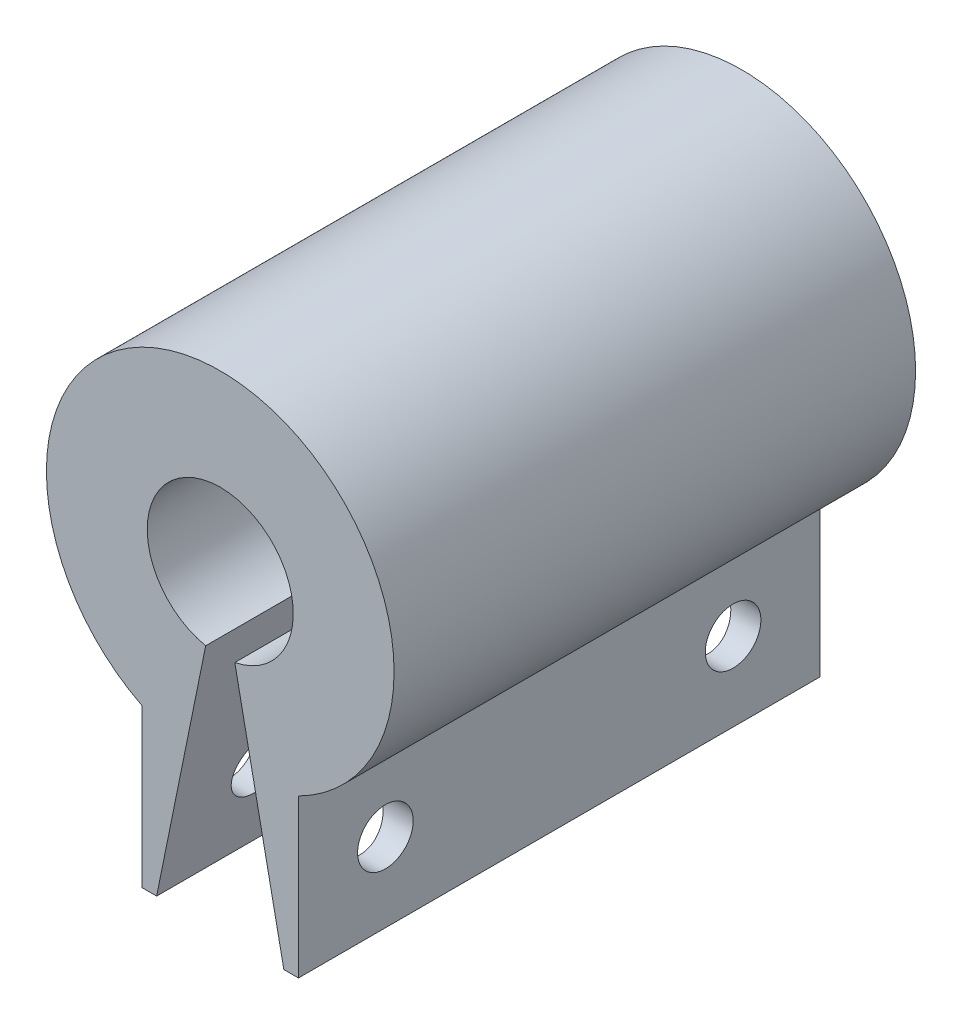
ISO-10303-21;
HEADER;
FILE_DESCRIPTION(('STEP AP214'),'2;1');
FILE_NAME('part.step','',(''),(''),'','','');
FILE_SCHEMA(('AUTOMOTIVE_DESIGN { 1 0 10303 214 1 1 1 1 }'));
ENDSEC;
DATA;
#1=APPLICATION_CONTEXT('core data for automotive mechanical design processes');
#2=APPLICATION_PROTOCOL_DEFINITION('international standard','automotive_design',2000,#1);
#3=PRODUCT_CONTEXT('',#1,'mechanical');
#4=PRODUCT('Part','Part','',(#3));
#5=PRODUCT_RELATED_PRODUCT_CATEGORY('part','',(#4));
#6=PRODUCT_DEFINITION_FORMATION('','',#4);
#7=PRODUCT_DEFINITION_CONTEXT('part definition',#1,'design');
#8=PRODUCT_DEFINITION('design','',#6,#7);
#9=PRODUCT_DEFINITION_SHAPE('','',#8);
#10=(LENGTH_UNIT() NAMED_UNIT(*) SI_UNIT(.MILLI.,.METRE.));
#11=(NAMED_UNIT(*) PLANE_ANGLE_UNIT() SI_UNIT($,.RADIAN.));
#12=(NAMED_UNIT(*) SI_UNIT($,.STERADIAN.) SOLID_ANGLE_UNIT());
#13=UNCERTAINTY_MEASURE_WITH_UNIT(LENGTH_MEASURE(1.E-05),#10,'distance_accuracy_value','');
#14=(GEOMETRIC_REPRESENTATION_CONTEXT(3) GLOBAL_UNCERTAINTY_ASSIGNED_CONTEXT((#13)) GLOBAL_UNIT_ASSIGNED_CONTEXT((#10,
#11,#12)) REPRESENTATION_CONTEXT('',''));
#15=CARTESIAN_POINT('',(0.,0.,0.));
#16=DIRECTION('',(0.,0.,1.));
#17=DIRECTION('',(1.,0.,0.));
#18=AXIS2_PLACEMENT_3D('',#15,#16,#17);
#19=CARTESIAN_POINT('',(-4.5,-18.,30.));
#20=DIRECTION('',(0.,1.,0.));
#21=DIRECTION('',(0.,0.,1.));
#22=AXIS2_PLACEMENT_3D('',#19,#20,#21);
#23=PLANE('',#22);
#24=DIRECTION('',(1.,0.,0.));
#25=VECTOR('',#24,1.);
#26=CARTESIAN_POINT('',(-4.5,-18.,0.));
#27=LINE('',#26,#25);
#28=CARTESIAN_POINT('',(-4.5,-18.,0.));
#29=VERTEX_POINT('',#28);
#30=CARTESIAN_POINT('',(-3.65866106138832,-18.,0.));
#31=VERTEX_POINT('',#30);
#32=EDGE_CURVE('E136',#29,#31,#27,.T.);
#33=ORIENTED_EDGE('',*,*,#32,.T.);
#34=DIRECTION('',(0.,0.,1.));
#35=VECTOR('',#34,1.);
#36=CARTESIAN_POINT('',(-3.65866106138832,-18.,0.));
#37=LINE('',#36,#35);
#38=CARTESIAN_POINT('',(-3.65866106138832,-18.,30.));
#39=VERTEX_POINT('',#38);
#40=EDGE_CURVE('E156',#31,#39,#37,.T.);
#41=ORIENTED_EDGE('',*,*,#40,.T.);
#42=DIRECTION('',(1.,0.,0.));
#43=VECTOR('',#42,1.);
#44=CARTESIAN_POINT('',(-4.5,-18.,30.));
#45=LINE('',#44,#43);
#46=CARTESIAN_POINT('',(-4.5,-18.,30.));
#47=VERTEX_POINT('',#46);
#48=EDGE_CURVE('E211',#47,#39,#45,.T.);
#49=ORIENTED_EDGE('',*,*,#48,.F.);
#50=DIRECTION('',(0.,0.,-1.));
#51=VECTOR('',#50,1.);
#52=CARTESIAN_POINT('',(-4.5,-18.,30.));
#53=LINE('',#52,#51);
#54=EDGE_CURVE('E44',#47,#29,#53,.T.);
#55=ORIENTED_EDGE('',*,*,#54,.T.);
#56=EDGE_LOOP('',(#33,#41,#49,#55));
#57=FACE_BOUND('',#56,.T.);
#58=ADVANCED_FACE('F35',(#57),#23,.F.);
#59=CARTESIAN_POINT('',(-10.,-13.4651427748729,5.));
#60=DIRECTION('',(1.,0.,0.));
#61=DIRECTION('',(0.,1.,0.));
#62=AXIS2_PLACEMENT_3D('',#59,#60,#61);
#63=CYLINDRICAL_SURFACE('',#62,1.6);
#64=CARTESIAN_POINT('',(-2.73691075313677,-13.4651427748729,5.));
#65=DIRECTION('',(-0.979961705036587,0.199185985103837,0.));
#66=DIRECTION('',(0.199185985103837,0.979961705036587,0.));
#67=AXIS2_PLACEMENT_3D('',#64,#65,#66);
#68=ELLIPSE('',#67,1.63271686207398,1.6);
#69=CARTESIAN_POINT('',(-2.41169643656892,-11.8651427748729,5.));
#70=VERTEX_POINT('',#69);
#71=EDGE_CURVE('E176',#70,#70,#68,.F.);
#72=ORIENTED_EDGE('',*,*,#71,.T.);
#73=EDGE_LOOP('',(#72));
#74=FACE_BOUND('',#73,.T.);
#75=CARTESIAN_POINT('',(-4.5,-13.4651427748729,5.));
#76=DIRECTION('',(1.,0.,0.));
#77=DIRECTION('',(0.,1.,0.));
#78=AXIS2_PLACEMENT_3D('',#75,#76,#77);
#79=CIRCLE('',#78,1.6);
#80=CARTESIAN_POINT('',(-4.5,-11.8651427748729,5.));
#81=VERTEX_POINT('',#80);
#82=EDGE_CURVE('E188',#81,#81,#79,.T.);
#83=ORIENTED_EDGE('',*,*,#82,.F.);
#84=EDGE_LOOP('',(#83));
#85=FACE_BOUND('',#84,.T.);
#86=ADVANCED_FACE('F241',(#74,#85),#63,.F.);
#87=CARTESIAN_POINT('',(-10.,-13.4651427748729,25.));
#88=DIRECTION('',(1.,0.,0.));
#89=DIRECTION('',(0.,1.,0.));
#90=AXIS2_PLACEMENT_3D('',#87,#88,#89);
#91=CYLINDRICAL_SURFACE('',#90,1.6);
#92=CARTESIAN_POINT('',(-2.73691075313677,-13.4651427748729,25.));
#93=DIRECTION('',(-0.979961705036587,0.199185985103837,0.));
#94=DIRECTION('',(0.199185985103837,0.979961705036587,0.));
#95=AXIS2_PLACEMENT_3D('',#92,#93,#94);
#96=ELLIPSE('',#95,1.63271686207398,1.6);
#97=CARTESIAN_POINT('',(-2.41169643656892,-11.8651427748729,25.));
#98=VERTEX_POINT('',#97);
#99=EDGE_CURVE('E39',#98,#98,#96,.F.);
#100=ORIENTED_EDGE('',*,*,#99,.T.);
#101=EDGE_LOOP('',(#100));
#102=FACE_BOUND('',#101,.T.);
#103=CARTESIAN_POINT('',(-4.5,-13.4651427748729,25.));
#104=DIRECTION('',(1.,0.,0.));
#105=DIRECTION('',(0.,1.,0.));
#106=AXIS2_PLACEMENT_3D('',#103,#104,#105);
#107=CIRCLE('',#106,1.6);
#108=CARTESIAN_POINT('',(-4.5,-11.8651427748729,25.));
#109=VERTEX_POINT('',#108);
#110=EDGE_CURVE('E193',#109,#109,#107,.T.);
#111=ORIENTED_EDGE('',*,*,#110,.F.);
#112=EDGE_LOOP('',(#111));
#113=FACE_BOUND('',#112,.T.);
#114=ADVANCED_FACE('F245',(#102,#113),#91,.F.);
#115=CARTESIAN_POINT('',(0.,0.,30.));
#116=DIRECTION('',(0.,0.,-1.));
#117=DIRECTION('',(-1.,0.,0.));
#118=AXIS2_PLACEMENT_3D('',#115,#116,#117);
#119=CYLINDRICAL_SURFACE('',#118,10.);
#120=CARTESIAN_POINT('',(0.,0.,0.));
#121=DIRECTION('',(0.,0.,1.));
#122=DIRECTION('',(1.,0.,0.));
#123=AXIS2_PLACEMENT_3D('',#120,#121,#122);
#124=CIRCLE('',#123,10.);
#125=CARTESIAN_POINT('',(4.5,-8.93028554974588,0.));
#126=VERTEX_POINT('',#125);
#127=CARTESIAN_POINT('',(-4.5,-8.93028554974588,0.));
#128=VERTEX_POINT('',#127);
#129=EDGE_CURVE('E140',#126,#128,#124,.T.);
#130=ORIENTED_EDGE('',*,*,#129,.T.);
#131=DIRECTION('',(0.,0.,-1.));
#132=VECTOR('',#131,1.);
#133=CARTESIAN_POINT('',(-4.5,-8.93028554974588,30.));
#134=LINE('',#133,#132);
#135=CARTESIAN_POINT('',(-4.5,-8.93028554974588,30.));
#136=VERTEX_POINT('',#135);
#137=EDGE_CURVE('E11',#136,#128,#134,.T.);
#138=ORIENTED_EDGE('',*,*,#137,.F.);
#139=CARTESIAN_POINT('',(0.,0.,30.));
#140=DIRECTION('',(0.,0.,1.));
#141=DIRECTION('',(1.,0.,0.));
#142=AXIS2_PLACEMENT_3D('',#139,#140,#141);
#143=CIRCLE('',#142,10.);
#144=CARTESIAN_POINT('',(4.5,-8.93028554974588,30.));
#145=VERTEX_POINT('',#144);
#146=EDGE_CURVE('E145',#145,#136,#143,.T.);
#147=ORIENTED_EDGE('',*,*,#146,.F.);
#148=DIRECTION('',(0.,0.,-1.));
#149=VECTOR('',#148,1.);
#150=CARTESIAN_POINT('',(4.5,-8.93028554974588,30.));
#151=LINE('',#150,#149);
#152=EDGE_CURVE('E146',#145,#126,#151,.T.);
#153=ORIENTED_EDGE('',*,*,#152,.T.);
#154=EDGE_LOOP('',(#130,#138,#147,#153));
#155=FACE_BOUND('',#154,.T.);
#156=ADVANCED_FACE('F37',(#155),#119,.T.);
#157=CARTESIAN_POINT('',(-4.5,-8.93028554974588,30.));
#158=DIRECTION('',(1.,0.,0.));
#159=DIRECTION('',(0.,1.,0.));
#160=AXIS2_PLACEMENT_3D('',#157,#158,#159);
#161=PLANE('',#160);
#162=ORIENTED_EDGE('',*,*,#110,.T.);
#163=EDGE_LOOP('',(#162));
#164=FACE_BOUND('',#163,.T.);
#165=ORIENTED_EDGE('',*,*,#82,.T.);
#166=EDGE_LOOP('',(#165));
#167=FACE_BOUND('',#166,.T.);
#168=DIRECTION('',(0.,-1.,0.));
#169=VECTOR('',#168,1.);
#170=CARTESIAN_POINT('',(-4.5,-8.93028554974588,0.));
#171=LINE('',#170,#169);
#172=EDGE_CURVE('E137',#128,#29,#171,.T.);
#173=ORIENTED_EDGE('',*,*,#172,.T.);
#174=ORIENTED_EDGE('',*,*,#54,.F.);
#175=DIRECTION('',(0.,-1.,0.));
#176=VECTOR('',#175,1.);
#177=CARTESIAN_POINT('',(-4.5,-8.93028554974588,30.));
#178=LINE('',#177,#176);
#179=EDGE_CURVE('E209',#136,#47,#178,.T.);
#180=ORIENTED_EDGE('',*,*,#179,.F.);
#181=ORIENTED_EDGE('',*,*,#137,.T.);
#182=EDGE_LOOP('',(#173,#174,#180,#181));
#183=FACE_BOUND('',#182,.T.);
#184=ADVANCED_FACE('F221',(#164,#167,#183),#161,.F.);
#185=CARTESIAN_POINT('',(3.65866106138832,-18.,30.));
#186=VERTEX_POINT('',#185);
#187=CARTESIAN_POINT('',(4.5,-18.,30.));
#188=VERTEX_POINT('',#187);
#189=EDGE_CURVE('E130',#186,#188,#45,.T.);
#190=ORIENTED_EDGE('',*,*,#189,.F.);
#191=DIRECTION('',(0.,0.,1.));
#192=VECTOR('',#191,1.);
#193=CARTESIAN_POINT('',(3.65866106138832,-18.,0.));
#194=LINE('',#193,#192);
#195=CARTESIAN_POINT('',(3.65866106138832,-18.,0.));
#196=VERTEX_POINT('',#195);
#197=EDGE_CURVE('E115',#196,#186,#194,.T.);
#198=ORIENTED_EDGE('',*,*,#197,.F.);
#199=CARTESIAN_POINT('',(4.5,-18.,0.));
#200=VERTEX_POINT('',#199);
#201=EDGE_CURVE('E128',#196,#200,#27,.T.);
#202=ORIENTED_EDGE('',*,*,#201,.T.);
#203=DIRECTION('',(0.,0.,-1.));
#204=VECTOR('',#203,1.);
#205=CARTESIAN_POINT('',(4.5,-18.,30.));
#206=LINE('',#205,#204);
#207=EDGE_CURVE('E149',#188,#200,#206,.T.);
#208=ORIENTED_EDGE('',*,*,#207,.F.);
#209=EDGE_LOOP('',(#190,#198,#202,#208));
#210=FACE_BOUND('',#209,.T.);
#211=ADVANCED_FACE('F126',(#210),#23,.F.);
#212=CARTESIAN_POINT('',(4.5,-8.93028554974588,30.));
#213=DIRECTION('',(-1.,0.,0.));
#214=DIRECTION('',(0.,-1.,0.));
#215=AXIS2_PLACEMENT_3D('',#212,#213,#214);
#216=PLANE('',#215);
#217=CARTESIAN_POINT('',(4.5,-13.4651427748729,25.));
#218=DIRECTION('',(1.,0.,0.));
#219=DIRECTION('',(0.,1.,0.));
#220=AXIS2_PLACEMENT_3D('',#217,#218,#219);
#221=CIRCLE('',#220,1.6);
#222=CARTESIAN_POINT('',(4.5,-11.8651427748729,25.));
#223=VERTEX_POINT('',#222);
#224=EDGE_CURVE('E185',#223,#223,#221,.T.);
#225=ORIENTED_EDGE('',*,*,#224,.F.);
#226=EDGE_LOOP('',(#225));
#227=FACE_BOUND('',#226,.T.);
#228=CARTESIAN_POINT('',(4.5,-13.4651427748729,5.));
#229=DIRECTION('',(1.,0.,0.));
#230=DIRECTION('',(0.,1.,0.));
#231=AXIS2_PLACEMENT_3D('',#228,#229,#230);
#232=CIRCLE('',#231,1.6);
#233=CARTESIAN_POINT('',(4.5,-11.8651427748729,5.));
#234=VERTEX_POINT('',#233);
#235=EDGE_CURVE('E184',#234,#234,#232,.T.);
#236=ORIENTED_EDGE('',*,*,#235,.F.);
#237=EDGE_LOOP('',(#236));
#238=FACE_BOUND('',#237,.T.);
#239=DIRECTION('',(0.,1.,0.));
#240=VECTOR('',#239,1.);
#241=CARTESIAN_POINT('',(4.5,-8.93028554974588,0.));
#242=LINE('',#241,#240);
#243=EDGE_CURVE('E135',#200,#126,#242,.T.);
#244=ORIENTED_EDGE('',*,*,#243,.T.);
#245=ORIENTED_EDGE('',*,*,#152,.F.);
#246=DIRECTION('',(0.,1.,0.));
#247=VECTOR('',#246,1.);
#248=CARTESIAN_POINT('',(4.5,-8.93028554974588,30.));
#249=LINE('',#248,#247);
#250=EDGE_CURVE('E150',#188,#145,#249,.T.);
#251=ORIENTED_EDGE('',*,*,#250,.F.);
#252=ORIENTED_EDGE('',*,*,#207,.T.);
#253=EDGE_LOOP('',(#244,#245,#251,#252));
#254=FACE_BOUND('',#253,.T.);
#255=ADVANCED_FACE('F227',(#227,#238,#254),#216,.F.);
#256=CARTESIAN_POINT('',(0.,0.,30.));
#257=DIRECTION('',(0.,0.,1.));
#258=DIRECTION('',(1.,0.,0.));
#259=AXIS2_PLACEMENT_3D('',#256,#257,#258);
#260=PLANE('',#259);
#261=DIRECTION('',(-0.199185985103837,-0.979961705036587,0.));
#262=VECTOR('',#261,1.);
#263=CARTESIAN_POINT('',(-0.234043532497008,-1.15145500341799,30.));
#264=LINE('',#263,#262);
#265=CARTESIAN_POINT('',(-0.836581137436115,-4.11583916115366,30.));
#266=VERTEX_POINT('',#265);
#267=EDGE_CURVE('E122',#266,#39,#264,.T.);
#268=ORIENTED_EDGE('',*,*,#267,.F.);
#269=CARTESIAN_POINT('',(0.,0.,30.));
#270=DIRECTION('',(0.,0.,1.));
#271=DIRECTION('',(1.,0.,0.));
#272=AXIS2_PLACEMENT_3D('',#269,#270,#271);
#273=CIRCLE('',#272,4.2);
#274=CARTESIAN_POINT('',(0.836581137436115,-4.11583916115366,30.));
#275=VERTEX_POINT('',#274);
#276=EDGE_CURVE('E200',#275,#266,#273,.T.);
#277=ORIENTED_EDGE('',*,*,#276,.F.);
#278=DIRECTION('',(-0.199185985103837,0.979961705036587,0.));
#279=VECTOR('',#278,1.);
#280=CARTESIAN_POINT('',(0.234043532497008,-1.15145500341799,30.));
#281=LINE('',#280,#279);
#282=EDGE_CURVE('E341',#186,#275,#281,.T.);
#283=ORIENTED_EDGE('',*,*,#282,.F.);
#284=ORIENTED_EDGE('',*,*,#189,.T.);
#285=ORIENTED_EDGE('',*,*,#250,.T.);
#286=ORIENTED_EDGE('',*,*,#146,.T.);
#287=ORIENTED_EDGE('',*,*,#179,.T.);
#288=ORIENTED_EDGE('',*,*,#48,.T.);
#289=EDGE_LOOP('',(#268,#277,#283,#284,#285,#286,#287,#288));
#290=FACE_BOUND('',#289,.T.);
#291=ADVANCED_FACE('F224',(#290),#260,.T.);
#292=CARTESIAN_POINT('',(0.,0.,0.));
#293=DIRECTION('',(0.,0.,1.));
#294=DIRECTION('',(1.,0.,0.));
#295=AXIS2_PLACEMENT_3D('',#292,#293,#294);
#296=PLANE('',#295);
#297=CARTESIAN_POINT('',(0.,0.,0.));
#298=DIRECTION('',(0.,0.,-1.));
#299=DIRECTION('',(-1.,0.,0.));
#300=AXIS2_PLACEMENT_3D('',#297,#298,#299);
#301=CIRCLE('',#300,1.175);
#302=CARTESIAN_POINT('',(-0.234043532497008,-1.15145500341799,0.));
#303=VERTEX_POINT('',#302);
#304=CARTESIAN_POINT('',(0.234043532497008,-1.15145500341799,0.));
#305=VERTEX_POINT('',#304);
#306=EDGE_CURVE('E196',#303,#305,#301,.T.);
#307=ORIENTED_EDGE('',*,*,#306,.F.);
#308=DIRECTION('',(-0.199185985103837,-0.979961705036587,0.));
#309=VECTOR('',#308,1.);
#310=CARTESIAN_POINT('',(-0.234043532497008,-1.15145500341799,0.));
#311=LINE('',#310,#309);
#312=EDGE_CURVE('E52',#303,#31,#311,.T.);
#313=ORIENTED_EDGE('',*,*,#312,.T.);
#314=ORIENTED_EDGE('',*,*,#32,.F.);
#315=ORIENTED_EDGE('',*,*,#172,.F.);
#316=ORIENTED_EDGE('',*,*,#129,.F.);
#317=ORIENTED_EDGE('',*,*,#243,.F.);
#318=ORIENTED_EDGE('',*,*,#201,.F.);
#319=DIRECTION('',(-0.199185985103837,0.979961705036587,0.));
#320=VECTOR('',#319,1.);
#321=CARTESIAN_POINT('',(0.234043532497008,-1.15145500341799,0.));
#322=LINE('',#321,#320);
#323=EDGE_CURVE('E112',#196,#305,#322,.T.);
#324=ORIENTED_EDGE('',*,*,#323,.T.);
#325=EDGE_LOOP('',(#307,#313,#314,#315,#316,#317,#318,#324));
#326=FACE_BOUND('',#325,.T.);
#327=ADVANCED_FACE('F133',(#326),#296,.F.);
#328=CARTESIAN_POINT('',(0.,0.,15.));
#329=DIRECTION('',(0.,0.,1.));
#330=DIRECTION('',(1.,0.,0.));
#331=AXIS2_PLACEMENT_3D('',#328,#329,#330);
#332=CYLINDRICAL_SURFACE('',#331,4.2);
#333=ORIENTED_EDGE('',*,*,#276,.T.);
#334=DIRECTION('',(0.,0.,1.));
#335=VECTOR('',#334,1.);
#336=CARTESIAN_POINT('',(-0.836581137436115,-4.11583916115366,15.));
#337=LINE('',#336,#335);
#338=CARTESIAN_POINT('',(-0.836581137436115,-4.11583916115366,15.));
#339=VERTEX_POINT('',#338);
#340=EDGE_CURVE('E181',#266,#339,#337,.F.);
#341=ORIENTED_EDGE('',*,*,#340,.T.);
#342=CARTESIAN_POINT('',(0.,0.,15.));
#343=DIRECTION('',(0.,0.,1.));
#344=DIRECTION('',(1.,0.,0.));
#345=AXIS2_PLACEMENT_3D('',#342,#343,#344);
#346=CIRCLE('',#345,4.2);
#347=CARTESIAN_POINT('',(0.836581137436115,-4.11583916115366,15.));
#348=VERTEX_POINT('',#347);
#349=EDGE_CURVE('E202',#348,#339,#346,.T.);
#350=ORIENTED_EDGE('',*,*,#349,.F.);
#351=DIRECTION('',(0.,0.,1.));
#352=VECTOR('',#351,1.);
#353=CARTESIAN_POINT('',(0.836581137436115,-4.11583916115366,15.));
#354=LINE('',#353,#352);
#355=EDGE_CURVE('E173',#348,#275,#354,.T.);
#356=ORIENTED_EDGE('',*,*,#355,.T.);
#357=EDGE_LOOP('',(#333,#341,#350,#356));
#358=FACE_BOUND('',#357,.T.);
#359=ADVANCED_FACE('F287',(#358),#332,.F.);
#360=CARTESIAN_POINT('',(0.,0.,15.));
#361=DIRECTION('',(0.,0.,1.));
#362=DIRECTION('',(1.,0.,0.));
#363=AXIS2_PLACEMENT_3D('',#360,#361,#362);
#364=PLANE('',#363);
#365=DIRECTION('',(-0.199185985103837,-0.979961705036587,0.));
#366=VECTOR('',#365,1.);
#367=CARTESIAN_POINT('',(0.,0.,15.));
#368=LINE('',#367,#366);
#369=CARTESIAN_POINT('',(-0.234043532497008,-1.15145500341799,15.));
#370=VERTEX_POINT('',#369);
#371=EDGE_CURVE('E179',#370,#339,#368,.T.);
#372=ORIENTED_EDGE('',*,*,#371,.F.);
#373=CARTESIAN_POINT('',(0.,0.,15.));
#374=DIRECTION('',(0.,0.,-1.));
#375=DIRECTION('',(-1.,0.,0.));
#376=AXIS2_PLACEMENT_3D('',#373,#374,#375);
#377=CIRCLE('',#376,1.175);
#378=CARTESIAN_POINT('',(0.234043532497008,-1.15145500341799,15.));
#379=VERTEX_POINT('',#378);
#380=EDGE_CURVE('E197',#370,#379,#377,.T.);
#381=ORIENTED_EDGE('',*,*,#380,.T.);
#382=DIRECTION('',(-0.199185985103837,0.979961705036587,0.));
#383=VECTOR('',#382,1.);
#384=CARTESIAN_POINT('',(0.,0.,15.));
#385=LINE('',#384,#383);
#386=EDGE_CURVE('E60',#348,#379,#385,.T.);
#387=ORIENTED_EDGE('',*,*,#386,.F.);
#388=ORIENTED_EDGE('',*,*,#349,.T.);
#389=EDGE_LOOP('',(#372,#381,#387,#388));
#390=FACE_BOUND('',#389,.T.);
#391=ADVANCED_FACE('F280',(#390),#364,.T.);
#392=CARTESIAN_POINT('',(0.,0.,15.));
#393=DIRECTION('',(0.,0.,-1.));
#394=DIRECTION('',(-1.,0.,0.));
#395=AXIS2_PLACEMENT_3D('',#392,#393,#394);
#396=CYLINDRICAL_SURFACE('',#395,1.175);
#397=ORIENTED_EDGE('',*,*,#380,.F.);
#398=DIRECTION('',(0.,0.,1.));
#399=VECTOR('',#398,1.);
#400=CARTESIAN_POINT('',(-0.234043532497008,-1.15145500341799,0.));
#401=LINE('',#400,#399);
#402=EDGE_CURVE('E162',#303,#370,#401,.T.);
#403=ORIENTED_EDGE('',*,*,#402,.F.);
#404=ORIENTED_EDGE('',*,*,#306,.T.);
#405=DIRECTION('',(0.,0.,1.));
#406=VECTOR('',#405,1.);
#407=CARTESIAN_POINT('',(0.234043532497008,-1.15145500341799,0.));
#408=LINE('',#407,#406);
#409=EDGE_CURVE('E117',#305,#379,#408,.T.);
#410=ORIENTED_EDGE('',*,*,#409,.T.);
#411=EDGE_LOOP('',(#397,#403,#404,#410));
#412=FACE_BOUND('',#411,.T.);
#413=ADVANCED_FACE('F274',(#412),#396,.F.);
#414=CARTESIAN_POINT('',(2.73691075313677,-13.4651427748729,5.));
#415=DIRECTION('',(0.979961705036587,0.199185985103837,0.));
#416=DIRECTION('',(0.199185985103837,-0.979961705036587,0.));
#417=AXIS2_PLACEMENT_3D('',#414,#415,#416);
#418=ELLIPSE('',#417,1.63271686207398,1.6);
#419=CARTESIAN_POINT('',(3.06212506970462,-15.0651427748729,5.));
#420=VERTEX_POINT('',#419);
#421=EDGE_CURVE('E155',#420,#420,#418,.F.);
#422=ORIENTED_EDGE('',*,*,#421,.T.);
#423=EDGE_LOOP('',(#422));
#424=FACE_BOUND('',#423,.T.);
#425=ORIENTED_EDGE('',*,*,#235,.T.);
#426=EDGE_LOOP('',(#425));
#427=FACE_BOUND('',#426,.T.);
#428=ADVANCED_FACE('F248',(#424,#427),#63,.F.);
#429=CARTESIAN_POINT('',(2.73691075313677,-13.4651427748729,25.));
#430=DIRECTION('',(0.979961705036587,0.199185985103837,0.));
#431=DIRECTION('',(0.199185985103837,-0.979961705036587,0.));
#432=AXIS2_PLACEMENT_3D('',#429,#430,#431);
#433=ELLIPSE('',#432,1.63271686207398,1.6);
#434=CARTESIAN_POINT('',(3.06212506970462,-15.0651427748729,25.));
#435=VERTEX_POINT('',#434);
#436=EDGE_CURVE('E153',#435,#435,#433,.F.);
#437=ORIENTED_EDGE('',*,*,#436,.T.);
#438=EDGE_LOOP('',(#437));
#439=FACE_BOUND('',#438,.T.);
#440=ORIENTED_EDGE('',*,*,#224,.T.);
#441=EDGE_LOOP('',(#440));
#442=FACE_BOUND('',#441,.T.);
#443=ADVANCED_FACE('F262',(#439,#442),#91,.F.);
#444=CARTESIAN_POINT('',(0.234043532497008,-1.15145500341799,0.));
#445=DIRECTION('',(0.979961705036587,0.199185985103837,0.));
#446=DIRECTION('',(-0.199185985103837,0.979961705036587,0.));
#447=AXIS2_PLACEMENT_3D('',#444,#445,#446);
#448=PLANE('',#447);
#449=ORIENTED_EDGE('',*,*,#436,.F.);
#450=EDGE_LOOP('',(#449));
#451=FACE_BOUND('',#450,.T.);
#452=ORIENTED_EDGE('',*,*,#421,.F.);
#453=EDGE_LOOP('',(#452));
#454=FACE_BOUND('',#453,.T.);
#455=ORIENTED_EDGE('',*,*,#386,.T.);
#456=ORIENTED_EDGE('',*,*,#409,.F.);
#457=ORIENTED_EDGE('',*,*,#323,.F.);
#458=ORIENTED_EDGE('',*,*,#197,.T.);
#459=ORIENTED_EDGE('',*,*,#282,.T.);
#460=ORIENTED_EDGE('',*,*,#355,.F.);
#461=EDGE_LOOP('',(#455,#456,#457,#458,#459,#460));
#462=FACE_BOUND('',#461,.T.);
#463=ADVANCED_FACE('F114',(#451,#454,#462),#448,.F.);
#464=CARTESIAN_POINT('',(-0.234043532497008,-1.15145500341799,0.));
#465=DIRECTION('',(-0.979961705036587,0.199185985103837,0.));
#466=DIRECTION('',(-0.199185985103837,-0.979961705036587,0.));
#467=AXIS2_PLACEMENT_3D('',#464,#465,#466);
#468=PLANE('',#467);
#469=ORIENTED_EDGE('',*,*,#99,.F.);
#470=EDGE_LOOP('',(#469));
#471=FACE_BOUND('',#470,.T.);
#472=ORIENTED_EDGE('',*,*,#71,.F.);
#473=EDGE_LOOP('',(#472));
#474=FACE_BOUND('',#473,.T.);
#475=ORIENTED_EDGE('',*,*,#267,.T.);
#476=ORIENTED_EDGE('',*,*,#40,.F.);
#477=ORIENTED_EDGE('',*,*,#312,.F.);
#478=ORIENTED_EDGE('',*,*,#402,.T.);
#479=ORIENTED_EDGE('',*,*,#371,.T.);
#480=ORIENTED_EDGE('',*,*,#340,.F.);
#481=EDGE_LOOP('',(#475,#476,#477,#478,#479,#480));
#482=FACE_BOUND('',#481,.T.);
#483=ADVANCED_FACE('F272',(#471,#474,#482),#468,.F.);
#484=CLOSED_SHELL('',(#58,#86,#114,#156,#184,#211,#255,#291,#327,#359,#391,#413,#428,#443,#463,#483));
#485=MANIFOLD_SOLID_BREP('B2',#484);
#486=ADVANCED_BREP_SHAPE_REPRESENTATION('',(#18,#485),#14);
#487=SHAPE_DEFINITION_REPRESENTATION(#9,#486);
ENDSEC;
END-ISO-10303-21;
